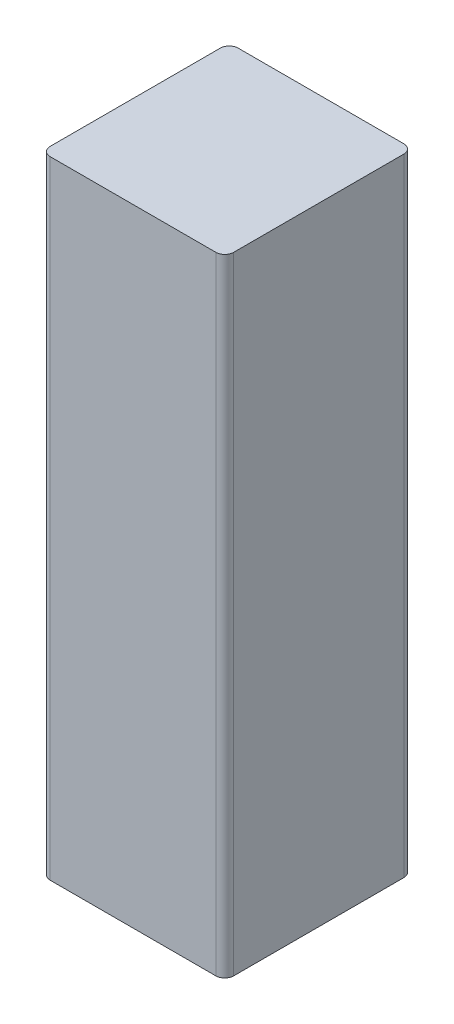
ISO-10303-21;
HEADER;
FILE_DESCRIPTION(('STEP AP214'),'2;1');
FILE_NAME('part.step','',(''),(''),'','','');
FILE_SCHEMA(('AUTOMOTIVE_DESIGN { 1 0 10303 214 1 1 1 1 }'));
ENDSEC;
DATA;
#1=APPLICATION_CONTEXT('core data for automotive mechanical design processes');
#2=APPLICATION_PROTOCOL_DEFINITION('international standard','automotive_design',2000,#1);
#3=PRODUCT_CONTEXT('',#1,'mechanical');
#4=PRODUCT('Part','Part','',(#3));
#5=PRODUCT_RELATED_PRODUCT_CATEGORY('part','',(#4));
#6=PRODUCT_DEFINITION_FORMATION('','',#4);
#7=PRODUCT_DEFINITION_CONTEXT('part definition',#1,'design');
#8=PRODUCT_DEFINITION('design','',#6,#7);
#9=PRODUCT_DEFINITION_SHAPE('','',#8);
#10=(LENGTH_UNIT() NAMED_UNIT(*) SI_UNIT(.MILLI.,.METRE.));
#11=(NAMED_UNIT(*) PLANE_ANGLE_UNIT() SI_UNIT($,.RADIAN.));
#12=(NAMED_UNIT(*) SI_UNIT($,.STERADIAN.) SOLID_ANGLE_UNIT());
#13=UNCERTAINTY_MEASURE_WITH_UNIT(LENGTH_MEASURE(1.E-05),#10,'distance_accuracy_value','');
#14=(GEOMETRIC_REPRESENTATION_CONTEXT(3) GLOBAL_UNCERTAINTY_ASSIGNED_CONTEXT((#13)) GLOBAL_UNIT_ASSIGNED_CONTEXT((#10,
#11,#12)) REPRESENTATION_CONTEXT('',''));
#15=CARTESIAN_POINT('',(0.,0.,0.));
#16=DIRECTION('',(0.,0.,1.));
#17=DIRECTION('',(1.,0.,0.));
#18=AXIS2_PLACEMENT_3D('',#15,#16,#17);
#19=CARTESIAN_POINT('',(-18.5,140.,19.));
#20=DIRECTION('',(0.,-1.,0.));
#21=DIRECTION('',(0.,0.,-1.));
#22=AXIS2_PLACEMENT_3D('',#19,#20,#21);
#23=CYLINDRICAL_SURFACE('',#22,2.00000000000001);
#24=CARTESIAN_POINT('',(-18.5,0.,19.));
#25=DIRECTION('',(0.,1.,0.));
#26=DIRECTION('',(0.,0.,-1.));
#27=AXIS2_PLACEMENT_3D('',#24,#25,#26);
#28=CIRCLE('',#27,2.00000000000001);
#29=CARTESIAN_POINT('',(-20.5,0.,19.));
#30=VERTEX_POINT('',#29);
#31=CARTESIAN_POINT('',(-18.5,0.,21.));
#32=VERTEX_POINT('',#31);
#33=EDGE_CURVE('E146',#30,#32,#28,.T.);
#34=ORIENTED_EDGE('',*,*,#33,.T.);
#35=DIRECTION('',(0.,-1.,0.));
#36=VECTOR('',#35,1.);
#37=CARTESIAN_POINT('',(-18.5,140.,21.));
#38=LINE('',#37,#36);
#39=CARTESIAN_POINT('',(-18.5,140.,21.));
#40=VERTEX_POINT('',#39);
#41=EDGE_CURVE('E11',#40,#32,#38,.T.);
#42=ORIENTED_EDGE('',*,*,#41,.F.);
#43=CARTESIAN_POINT('',(-18.5,140.,19.));
#44=DIRECTION('',(0.,1.,0.));
#45=DIRECTION('',(0.,0.,-1.));
#46=AXIS2_PLACEMENT_3D('',#43,#44,#45);
#47=CIRCLE('',#46,2.00000000000001);
#48=CARTESIAN_POINT('',(-20.5,140.,19.));
#49=VERTEX_POINT('',#48);
#50=EDGE_CURVE('E168',#49,#40,#47,.T.);
#51=ORIENTED_EDGE('',*,*,#50,.F.);
#52=DIRECTION('',(0.,-1.,0.));
#53=VECTOR('',#52,1.);
#54=CARTESIAN_POINT('',(-20.5,140.,19.));
#55=LINE('',#54,#53);
#56=EDGE_CURVE('E142',#49,#30,#55,.T.);
#57=ORIENTED_EDGE('',*,*,#56,.T.);
#58=EDGE_LOOP('',(#34,#42,#51,#57));
#59=FACE_BOUND('',#58,.T.);
#60=ADVANCED_FACE('F45',(#59),#23,.T.);
#61=CARTESIAN_POINT('',(18.5,140.,21.));
#62=DIRECTION('',(0.,0.,-1.));
#63=DIRECTION('',(-1.,0.,0.));
#64=AXIS2_PLACEMENT_3D('',#61,#62,#63);
#65=PLANE('',#64);
#66=DIRECTION('',(1.,0.,0.));
#67=VECTOR('',#66,1.);
#68=CARTESIAN_POINT('',(18.5,0.,21.));
#69=LINE('',#68,#67);
#70=CARTESIAN_POINT('',(18.5,0.,21.));
#71=VERTEX_POINT('',#70);
#72=EDGE_CURVE('E150',#32,#71,#69,.T.);
#73=ORIENTED_EDGE('',*,*,#72,.T.);
#74=DIRECTION('',(0.,-1.,0.));
#75=VECTOR('',#74,1.);
#76=CARTESIAN_POINT('',(18.5,140.,21.));
#77=LINE('',#76,#75);
#78=CARTESIAN_POINT('',(18.5,140.,21.));
#79=VERTEX_POINT('',#78);
#80=EDGE_CURVE('E54',#79,#71,#77,.T.);
#81=ORIENTED_EDGE('',*,*,#80,.F.);
#82=DIRECTION('',(1.,0.,0.));
#83=VECTOR('',#82,1.);
#84=CARTESIAN_POINT('',(18.5,140.,21.));
#85=LINE('',#84,#83);
#86=EDGE_CURVE('E105',#40,#79,#85,.T.);
#87=ORIENTED_EDGE('',*,*,#86,.F.);
#88=ORIENTED_EDGE('',*,*,#41,.T.);
#89=EDGE_LOOP('',(#73,#81,#87,#88));
#90=FACE_BOUND('',#89,.T.);
#91=ADVANCED_FACE('F214',(#90),#65,.F.);
#92=CARTESIAN_POINT('',(18.5,140.,19.));
#93=DIRECTION('',(0.,-1.,0.));
#94=DIRECTION('',(0.,0.,-1.));
#95=AXIS2_PLACEMENT_3D('',#92,#93,#94);
#96=CYLINDRICAL_SURFACE('',#95,2.);
#97=CARTESIAN_POINT('',(18.5,0.,19.));
#98=DIRECTION('',(0.,1.,0.));
#99=DIRECTION('',(0.,0.,1.));
#100=AXIS2_PLACEMENT_3D('',#97,#98,#99);
#101=CIRCLE('',#100,2.);
#102=CARTESIAN_POINT('',(20.5,0.,19.));
#103=VERTEX_POINT('',#102);
#104=EDGE_CURVE('E153',#71,#103,#101,.T.);
#105=ORIENTED_EDGE('',*,*,#104,.T.);
#106=DIRECTION('',(0.,-1.,0.));
#107=VECTOR('',#106,1.);
#108=CARTESIAN_POINT('',(20.5,140.,19.));
#109=LINE('',#108,#107);
#110=CARTESIAN_POINT('',(20.5,140.,19.));
#111=VERTEX_POINT('',#110);
#112=EDGE_CURVE('E179',#111,#103,#109,.T.);
#113=ORIENTED_EDGE('',*,*,#112,.F.);
#114=CARTESIAN_POINT('',(18.5,140.,19.));
#115=DIRECTION('',(0.,1.,0.));
#116=DIRECTION('',(0.,0.,1.));
#117=AXIS2_PLACEMENT_3D('',#114,#115,#116);
#118=CIRCLE('',#117,2.);
#119=EDGE_CURVE('E189',#79,#111,#118,.T.);
#120=ORIENTED_EDGE('',*,*,#119,.F.);
#121=ORIENTED_EDGE('',*,*,#80,.T.);
#122=EDGE_LOOP('',(#105,#113,#120,#121));
#123=FACE_BOUND('',#122,.T.);
#124=ADVANCED_FACE('F187',(#123),#96,.T.);
#125=CARTESIAN_POINT('',(20.5,140.,19.));
#126=DIRECTION('',(-1.,0.,0.));
#127=DIRECTION('',(0.,0.,1.));
#128=AXIS2_PLACEMENT_3D('',#125,#126,#127);
#129=PLANE('',#128);
#130=DIRECTION('',(0.,0.,-1.));
#131=VECTOR('',#130,1.);
#132=CARTESIAN_POINT('',(20.5,0.,19.));
#133=LINE('',#132,#131);
#134=CARTESIAN_POINT('',(20.5,0.,-19.));
#135=VERTEX_POINT('',#134);
#136=EDGE_CURVE('E156',#103,#135,#133,.T.);
#137=ORIENTED_EDGE('',*,*,#136,.T.);
#138=DIRECTION('',(0.,-1.,0.));
#139=VECTOR('',#138,1.);
#140=CARTESIAN_POINT('',(20.5,140.,-19.));
#141=LINE('',#140,#139);
#142=CARTESIAN_POINT('',(20.5,140.,-19.));
#143=VERTEX_POINT('',#142);
#144=EDGE_CURVE('E175',#143,#135,#141,.T.);
#145=ORIENTED_EDGE('',*,*,#144,.F.);
#146=DIRECTION('',(0.,0.,-1.));
#147=VECTOR('',#146,1.);
#148=CARTESIAN_POINT('',(20.5,140.,19.));
#149=LINE('',#148,#147);
#150=EDGE_CURVE('E202',#111,#143,#149,.T.);
#151=ORIENTED_EDGE('',*,*,#150,.F.);
#152=ORIENTED_EDGE('',*,*,#112,.T.);
#153=EDGE_LOOP('',(#137,#145,#151,#152));
#154=FACE_BOUND('',#153,.T.);
#155=ADVANCED_FACE('F197',(#154),#129,.F.);
#156=CARTESIAN_POINT('',(18.5,140.,-19.));
#157=DIRECTION('',(0.,-1.,0.));
#158=DIRECTION('',(0.,0.,-1.));
#159=AXIS2_PLACEMENT_3D('',#156,#157,#158);
#160=CYLINDRICAL_SURFACE('',#159,2.);
#161=CARTESIAN_POINT('',(18.5,0.,-19.));
#162=DIRECTION('',(0.,1.,0.));
#163=DIRECTION('',(0.,0.,1.));
#164=AXIS2_PLACEMENT_3D('',#161,#162,#163);
#165=CIRCLE('',#164,2.);
#166=CARTESIAN_POINT('',(18.5,0.,-21.));
#167=VERTEX_POINT('',#166);
#168=EDGE_CURVE('E159',#135,#167,#165,.T.);
#169=ORIENTED_EDGE('',*,*,#168,.T.);
#170=DIRECTION('',(0.,-1.,0.));
#171=VECTOR('',#170,1.);
#172=CARTESIAN_POINT('',(18.5,140.,-21.));
#173=LINE('',#172,#171);
#174=CARTESIAN_POINT('',(18.5,140.,-21.));
#175=VERTEX_POINT('',#174);
#176=EDGE_CURVE('E135',#175,#167,#173,.T.);
#177=ORIENTED_EDGE('',*,*,#176,.F.);
#178=CARTESIAN_POINT('',(18.5,140.,-19.));
#179=DIRECTION('',(0.,1.,0.));
#180=DIRECTION('',(0.,0.,1.));
#181=AXIS2_PLACEMENT_3D('',#178,#179,#180);
#182=CIRCLE('',#181,2.);
#183=EDGE_CURVE('E124',#143,#175,#182,.T.);
#184=ORIENTED_EDGE('',*,*,#183,.F.);
#185=ORIENTED_EDGE('',*,*,#144,.T.);
#186=EDGE_LOOP('',(#169,#177,#184,#185));
#187=FACE_BOUND('',#186,.T.);
#188=ADVANCED_FACE('F200',(#187),#160,.T.);
#189=CARTESIAN_POINT('',(18.5,140.,-21.));
#190=DIRECTION('',(0.,0.,1.));
#191=DIRECTION('',(1.,0.,0.));
#192=AXIS2_PLACEMENT_3D('',#189,#190,#191);
#193=PLANE('',#192);
#194=DIRECTION('',(-1.,0.,0.));
#195=VECTOR('',#194,1.);
#196=CARTESIAN_POINT('',(18.5,0.,-21.));
#197=LINE('',#196,#195);
#198=CARTESIAN_POINT('',(-18.5,0.,-21.));
#199=VERTEX_POINT('',#198);
#200=EDGE_CURVE('E133',#167,#199,#197,.T.);
#201=ORIENTED_EDGE('',*,*,#200,.T.);
#202=DIRECTION('',(0.,-1.,0.));
#203=VECTOR('',#202,1.);
#204=CARTESIAN_POINT('',(-18.5,140.,-21.));
#205=LINE('',#204,#203);
#206=CARTESIAN_POINT('',(-18.5,140.,-21.));
#207=VERTEX_POINT('',#206);
#208=EDGE_CURVE('E130',#207,#199,#205,.T.);
#209=ORIENTED_EDGE('',*,*,#208,.F.);
#210=DIRECTION('',(-1.,0.,0.));
#211=VECTOR('',#210,1.);
#212=CARTESIAN_POINT('',(18.5,140.,-21.));
#213=LINE('',#212,#211);
#214=EDGE_CURVE('E118',#175,#207,#213,.T.);
#215=ORIENTED_EDGE('',*,*,#214,.F.);
#216=ORIENTED_EDGE('',*,*,#176,.T.);
#217=EDGE_LOOP('',(#201,#209,#215,#216));
#218=FACE_BOUND('',#217,.T.);
#219=ADVANCED_FACE('F131',(#218),#193,.F.);
#220=CARTESIAN_POINT('',(-18.5,140.,-19.));
#221=DIRECTION('',(0.,-1.,0.));
#222=DIRECTION('',(0.,0.,-1.));
#223=AXIS2_PLACEMENT_3D('',#220,#221,#222);
#224=CYLINDRICAL_SURFACE('',#223,2.);
#225=CARTESIAN_POINT('',(-18.5,0.,-19.));
#226=DIRECTION('',(0.,1.,0.));
#227=DIRECTION('',(0.,0.,1.));
#228=AXIS2_PLACEMENT_3D('',#225,#226,#227);
#229=CIRCLE('',#228,2.);
#230=CARTESIAN_POINT('',(-20.5,0.,-19.));
#231=VERTEX_POINT('',#230);
#232=EDGE_CURVE('E91',#199,#231,#229,.T.);
#233=ORIENTED_EDGE('',*,*,#232,.T.);
#234=DIRECTION('',(0.,-1.,0.));
#235=VECTOR('',#234,1.);
#236=CARTESIAN_POINT('',(-20.5,140.,-19.));
#237=LINE('',#236,#235);
#238=CARTESIAN_POINT('',(-20.5,140.,-19.));
#239=VERTEX_POINT('',#238);
#240=EDGE_CURVE('E136',#239,#231,#237,.T.);
#241=ORIENTED_EDGE('',*,*,#240,.F.);
#242=CARTESIAN_POINT('',(-18.5,140.,-19.));
#243=DIRECTION('',(0.,1.,0.));
#244=DIRECTION('',(0.,0.,1.));
#245=AXIS2_PLACEMENT_3D('',#242,#243,#244);
#246=CIRCLE('',#245,2.);
#247=EDGE_CURVE('E122',#207,#239,#246,.T.);
#248=ORIENTED_EDGE('',*,*,#247,.F.);
#249=ORIENTED_EDGE('',*,*,#208,.T.);
#250=EDGE_LOOP('',(#233,#241,#248,#249));
#251=FACE_BOUND('',#250,.T.);
#252=ADVANCED_FACE('F138',(#251),#224,.T.);
#253=CARTESIAN_POINT('',(-20.5,140.,19.));
#254=DIRECTION('',(1.,0.,0.));
#255=DIRECTION('',(0.,0.,-1.));
#256=AXIS2_PLACEMENT_3D('',#253,#254,#255);
#257=PLANE('',#256);
#258=DIRECTION('',(0.,0.,1.));
#259=VECTOR('',#258,1.);
#260=CARTESIAN_POINT('',(-20.5,0.,19.));
#261=LINE('',#260,#259);
#262=EDGE_CURVE('E97',#231,#30,#261,.T.);
#263=ORIENTED_EDGE('',*,*,#262,.T.);
#264=ORIENTED_EDGE('',*,*,#56,.F.);
#265=DIRECTION('',(0.,0.,1.));
#266=VECTOR('',#265,1.);
#267=CARTESIAN_POINT('',(-20.5,140.,19.));
#268=LINE('',#267,#266);
#269=EDGE_CURVE('E62',#239,#49,#268,.T.);
#270=ORIENTED_EDGE('',*,*,#269,.F.);
#271=ORIENTED_EDGE('',*,*,#240,.T.);
#272=EDGE_LOOP('',(#263,#264,#270,#271));
#273=FACE_BOUND('',#272,.T.);
#274=ADVANCED_FACE('F230',(#273),#257,.F.);
#275=CARTESIAN_POINT('',(-18.5,140.,19.));
#276=DIRECTION('',(0.,-1.,0.));
#277=DIRECTION('',(0.,0.,-1.));
#278=AXIS2_PLACEMENT_3D('',#275,#276,#277);
#279=PLANE('',#278);
#280=ORIENTED_EDGE('',*,*,#50,.T.);
#281=ORIENTED_EDGE('',*,*,#86,.T.);
#282=ORIENTED_EDGE('',*,*,#119,.T.);
#283=ORIENTED_EDGE('',*,*,#150,.T.);
#284=ORIENTED_EDGE('',*,*,#183,.T.);
#285=ORIENTED_EDGE('',*,*,#214,.T.);
#286=ORIENTED_EDGE('',*,*,#247,.T.);
#287=ORIENTED_EDGE('',*,*,#269,.T.);
#288=EDGE_LOOP('',(#280,#281,#282,#283,#284,#285,#286,#287));
#289=FACE_BOUND('',#288,.T.);
#290=ADVANCED_FACE('F120',(#289),#279,.F.);
#291=CARTESIAN_POINT('',(-18.5,0.,19.));
#292=DIRECTION('',(0.,-1.,0.));
#293=DIRECTION('',(0.,0.,-1.));
#294=AXIS2_PLACEMENT_3D('',#291,#292,#293);
#295=PLANE('',#294);
#296=ORIENTED_EDGE('',*,*,#33,.F.);
#297=ORIENTED_EDGE('',*,*,#262,.F.);
#298=ORIENTED_EDGE('',*,*,#232,.F.);
#299=ORIENTED_EDGE('',*,*,#200,.F.);
#300=ORIENTED_EDGE('',*,*,#168,.F.);
#301=ORIENTED_EDGE('',*,*,#136,.F.);
#302=ORIENTED_EDGE('',*,*,#104,.F.);
#303=ORIENTED_EDGE('',*,*,#72,.F.);
#304=EDGE_LOOP('',(#296,#297,#298,#299,#300,#301,#302,#303));
#305=FACE_BOUND('',#304,.T.);
#306=ADVANCED_FACE('F193',(#305),#295,.T.);
#307=CLOSED_SHELL('',(#60,#91,#124,#155,#188,#219,#252,#274,#290,#306));
#308=MANIFOLD_SOLID_BREP('B2',#307);
#309=ADVANCED_BREP_SHAPE_REPRESENTATION('',(#18,#308),#14);
#310=SHAPE_DEFINITION_REPRESENTATION(#9,#309);
ENDSEC;
END-ISO-10303-21;
